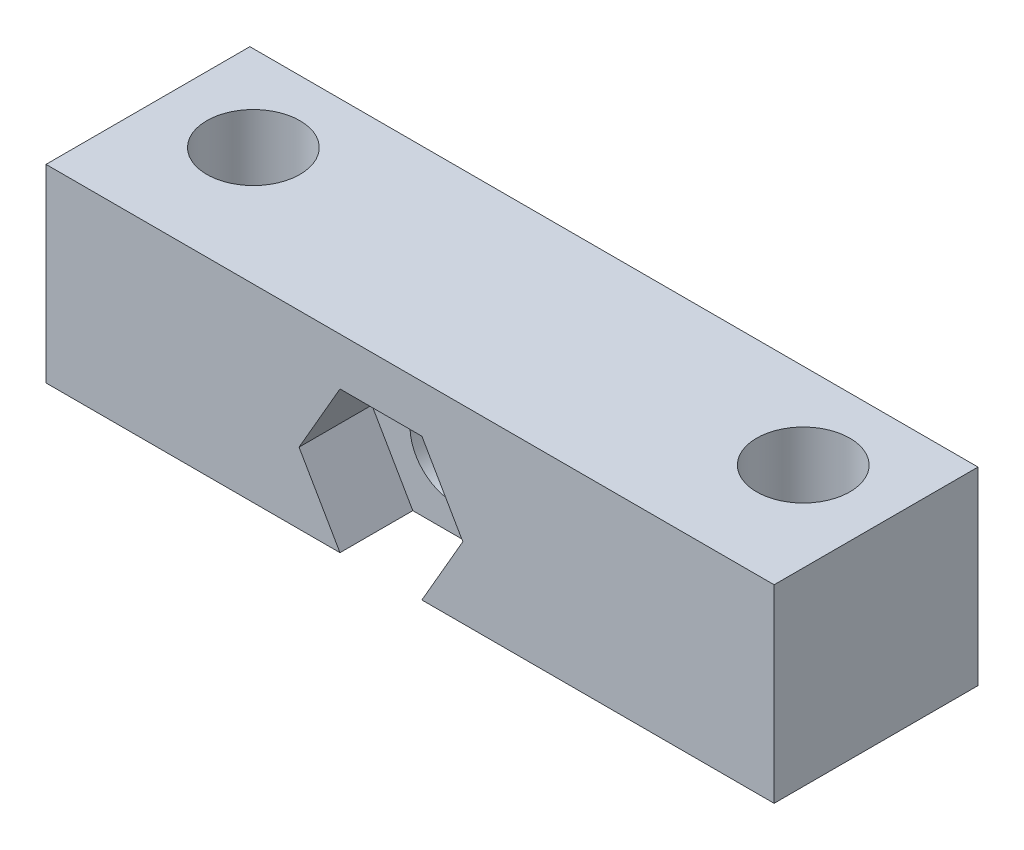
ISO-10303-21;
HEADER;
FILE_DESCRIPTION(('STEP AP214'),'2;1');
FILE_NAME('part.step','',(''),(''),'','','');
FILE_SCHEMA(('AUTOMOTIVE_DESIGN { 1 0 10303 214 1 1 1 1 }'));
ENDSEC;
DATA;
#1=APPLICATION_CONTEXT('core data for automotive mechanical design processes');
#2=APPLICATION_PROTOCOL_DEFINITION('international standard','automotive_design',2000,#1);
#3=PRODUCT_CONTEXT('',#1,'mechanical');
#4=PRODUCT('Part','Part','',(#3));
#5=PRODUCT_RELATED_PRODUCT_CATEGORY('part','',(#4));
#6=PRODUCT_DEFINITION_FORMATION('','',#4);
#7=PRODUCT_DEFINITION_CONTEXT('part definition',#1,'design');
#8=PRODUCT_DEFINITION('design','',#6,#7);
#9=PRODUCT_DEFINITION_SHAPE('','',#8);
#10=(LENGTH_UNIT() NAMED_UNIT(*) SI_UNIT(.MILLI.,.METRE.));
#11=(NAMED_UNIT(*) PLANE_ANGLE_UNIT() SI_UNIT($,.RADIAN.));
#12=(NAMED_UNIT(*) SI_UNIT($,.STERADIAN.) SOLID_ANGLE_UNIT());
#13=UNCERTAINTY_MEASURE_WITH_UNIT(LENGTH_MEASURE(1.E-05),#10,'distance_accuracy_value','');
#14=(GEOMETRIC_REPRESENTATION_CONTEXT(3) GLOBAL_UNCERTAINTY_ASSIGNED_CONTEXT((#13)) GLOBAL_UNIT_ASSIGNED_CONTEXT((#10,
#11,#12)) REPRESENTATION_CONTEXT('',''));
#15=CARTESIAN_POINT('',(0.,0.,0.));
#16=DIRECTION('',(0.,0.,1.));
#17=DIRECTION('',(1.,0.,0.));
#18=AXIS2_PLACEMENT_3D('',#15,#16,#17);
#19=CARTESIAN_POINT('',(0.,0.,0.));
#20=DIRECTION('',(0.,1.,0.));
#21=DIRECTION('',(0.,0.,1.));
#22=AXIS2_PLACEMENT_3D('',#19,#20,#21);
#23=PLANE('',#22);
#24=CARTESIAN_POINT('',(-8.44,0.,-0.560000000000005));
#25=DIRECTION('',(0.,1.,0.));
#26=DIRECTION('',(0.,0.,1.));
#27=AXIS2_PLACEMENT_3D('',#24,#25,#26);
#28=CIRCLE('',#27,1.6);
#29=CARTESIAN_POINT('',(-8.44,0.,-2.16));
#30=VERTEX_POINT('',#29);
#31=EDGE_CURVE('E285',#30,#30,#28,.T.);
#32=ORIENTED_EDGE('',*,*,#31,.T.);
#33=EDGE_LOOP('',(#32));
#34=FACE_BOUND('',#33,.T.);
#35=CARTESIAN_POINT('',(10.44,0.,-0.560000000000005));
#36=DIRECTION('',(0.,1.,0.));
#37=DIRECTION('',(0.,0.,1.));
#38=AXIS2_PLACEMENT_3D('',#35,#36,#37);
#39=CIRCLE('',#38,1.6);
#40=CARTESIAN_POINT('',(10.44,0.,-2.16));
#41=VERTEX_POINT('',#40);
#42=EDGE_CURVE('E301',#41,#41,#39,.T.);
#43=ORIENTED_EDGE('',*,*,#42,.T.);
#44=EDGE_LOOP('',(#43));
#45=FACE_BOUND('',#44,.T.);
#46=DIRECTION('',(0.,0.,-1.));
#47=VECTOR('',#46,1.);
#48=CARTESIAN_POINT('',(1.40584790547674,0.,3.5));
#49=LINE('',#48,#47);
#50=CARTESIAN_POINT('',(1.40584790547674,0.,3.5));
#51=VERTEX_POINT('',#50);
#52=CARTESIAN_POINT('',(1.40584790547674,0.,1.));
#53=VERTEX_POINT('',#52);
#54=EDGE_CURVE('E153',#51,#53,#49,.T.);
#55=ORIENTED_EDGE('',*,*,#54,.T.);
#56=DIRECTION('',(1.,0.,0.));
#57=VECTOR('',#56,1.);
#58=CARTESIAN_POINT('',(-1.40584790547674,0.,1.));
#59=LINE('',#58,#57);
#60=CARTESIAN_POINT('',(-1.40584790547674,0.,1.));
#61=VERTEX_POINT('',#60);
#62=EDGE_CURVE('E519',#61,#53,#59,.T.);
#63=ORIENTED_EDGE('',*,*,#62,.F.);
#64=DIRECTION('',(0.,0.,-1.));
#65=VECTOR('',#64,1.);
#66=CARTESIAN_POINT('',(-1.40584790547674,0.,3.5));
#67=LINE('',#66,#65);
#68=CARTESIAN_POINT('',(-1.40584790547674,0.,3.5));
#69=VERTEX_POINT('',#68);
#70=EDGE_CURVE('E217',#69,#61,#67,.T.);
#71=ORIENTED_EDGE('',*,*,#70,.F.);
#72=DIRECTION('',(1.,0.,0.));
#73=VECTOR('',#72,1.);
#74=CARTESIAN_POINT('',(-11.5,0.,3.5));
#75=LINE('',#74,#73);
#76=CARTESIAN_POINT('',(-11.5,0.,3.5));
#77=VERTEX_POINT('',#76);
#78=EDGE_CURVE('E183',#77,#69,#75,.T.);
#79=ORIENTED_EDGE('',*,*,#78,.F.);
#80=DIRECTION('',(0.,0.,1.));
#81=VECTOR('',#80,1.);
#82=CARTESIAN_POINT('',(-11.5,0.,-3.5));
#83=LINE('',#82,#81);
#84=CARTESIAN_POINT('',(-11.5,0.,-3.5));
#85=VERTEX_POINT('',#84);
#86=EDGE_CURVE('E184',#85,#77,#83,.T.);
#87=ORIENTED_EDGE('',*,*,#86,.F.);
#88=DIRECTION('',(-1.,0.,0.));
#89=VECTOR('',#88,1.);
#90=CARTESIAN_POINT('',(-11.5,0.,-3.5));
#91=LINE('',#90,#89);
#92=CARTESIAN_POINT('',(-1.40584790547674,0.,-3.5));
#93=VERTEX_POINT('',#92);
#94=EDGE_CURVE('E214',#93,#85,#91,.T.);
#95=ORIENTED_EDGE('',*,*,#94,.F.);
#96=DIRECTION('',(0.,0.,1.));
#97=VECTOR('',#96,1.);
#98=CARTESIAN_POINT('',(-1.40584790547674,0.,-3.5));
#99=LINE('',#98,#97);
#100=CARTESIAN_POINT('',(-1.40584790547674,0.,-1.));
#101=VERTEX_POINT('',#100);
#102=EDGE_CURVE('E282',#93,#101,#99,.T.);
#103=ORIENTED_EDGE('',*,*,#102,.T.);
#104=DIRECTION('',(1.,0.,0.));
#105=VECTOR('',#104,1.);
#106=CARTESIAN_POINT('',(-1.40584790547674,0.,-1.));
#107=LINE('',#106,#105);
#108=CARTESIAN_POINT('',(1.40584790547674,0.,-1.));
#109=VERTEX_POINT('',#108);
#110=EDGE_CURVE('E165',#101,#109,#107,.T.);
#111=ORIENTED_EDGE('',*,*,#110,.T.);
#112=DIRECTION('',(0.,0.,1.));
#113=VECTOR('',#112,1.);
#114=CARTESIAN_POINT('',(1.40584790547674,0.,-3.5));
#115=LINE('',#114,#113);
#116=CARTESIAN_POINT('',(1.40584790547674,0.,-3.5));
#117=VERTEX_POINT('',#116);
#118=EDGE_CURVE('E248',#117,#109,#115,.T.);
#119=ORIENTED_EDGE('',*,*,#118,.F.);
#120=CARTESIAN_POINT('',(13.5,0.,-3.5));
#121=VERTEX_POINT('',#120);
#122=EDGE_CURVE('E190',#121,#117,#91,.T.);
#123=ORIENTED_EDGE('',*,*,#122,.F.);
#124=DIRECTION('',(0.,0.,-1.));
#125=VECTOR('',#124,1.);
#126=CARTESIAN_POINT('',(13.5,0.,-3.5));
#127=LINE('',#126,#125);
#128=CARTESIAN_POINT('',(13.5,0.,3.5));
#129=VERTEX_POINT('',#128);
#130=EDGE_CURVE('E181',#129,#121,#127,.T.);
#131=ORIENTED_EDGE('',*,*,#130,.F.);
#132=EDGE_CURVE('E172',#51,#129,#75,.T.);
#133=ORIENTED_EDGE('',*,*,#132,.F.);
#134=EDGE_LOOP('',(#55,#63,#71,#79,#87,#95,#103,#111,#119,#123,#131,#133));
#135=FACE_BOUND('',#134,.T.);
#136=ADVANCED_FACE('F39',(#34,#45,#135),#23,.F.);
#137=CARTESIAN_POINT('',(0.,6.5,0.));
#138=DIRECTION('',(0.,1.,0.));
#139=DIRECTION('',(0.,0.,1.));
#140=AXIS2_PLACEMENT_3D('',#137,#138,#139);
#141=PLANE('',#140);
#142=CARTESIAN_POINT('',(10.44,6.5,-0.560000000000005));
#143=DIRECTION('',(0.,1.,0.));
#144=DIRECTION('',(0.,0.,1.));
#145=AXIS2_PLACEMENT_3D('',#142,#143,#144);
#146=CIRCLE('',#145,1.6);
#147=CARTESIAN_POINT('',(10.44,6.5,-2.16));
#148=VERTEX_POINT('',#147);
#149=EDGE_CURVE('E233',#148,#148,#146,.T.);
#150=ORIENTED_EDGE('',*,*,#149,.F.);
#151=EDGE_LOOP('',(#150));
#152=FACE_BOUND('',#151,.T.);
#153=DIRECTION('',(0.,0.,-1.));
#154=VECTOR('',#153,1.);
#155=CARTESIAN_POINT('',(13.5,6.5,-3.5));
#156=LINE('',#155,#154);
#157=CARTESIAN_POINT('',(13.5,6.5,3.5));
#158=VERTEX_POINT('',#157);
#159=CARTESIAN_POINT('',(13.5,6.5,-3.5));
#160=VERTEX_POINT('',#159);
#161=EDGE_CURVE('E189',#158,#160,#156,.T.);
#162=ORIENTED_EDGE('',*,*,#161,.T.);
#163=DIRECTION('',(-1.,0.,0.));
#164=VECTOR('',#163,1.);
#165=CARTESIAN_POINT('',(-11.5,6.5,-3.5));
#166=LINE('',#165,#164);
#167=CARTESIAN_POINT('',(-11.5,6.5,-3.5));
#168=VERTEX_POINT('',#167);
#169=EDGE_CURVE('E228',#160,#168,#166,.T.);
#170=ORIENTED_EDGE('',*,*,#169,.T.);
#171=DIRECTION('',(0.,0.,1.));
#172=VECTOR('',#171,1.);
#173=CARTESIAN_POINT('',(-11.5,6.5,-3.5));
#174=LINE('',#173,#172);
#175=CARTESIAN_POINT('',(-11.5,6.5,3.5));
#176=VERTEX_POINT('',#175);
#177=EDGE_CURVE('E209',#168,#176,#174,.T.);
#178=ORIENTED_EDGE('',*,*,#177,.T.);
#179=DIRECTION('',(1.,0.,0.));
#180=VECTOR('',#179,1.);
#181=CARTESIAN_POINT('',(-11.5,6.5,3.5));
#182=LINE('',#181,#180);
#183=EDGE_CURVE('E198',#176,#158,#182,.T.);
#184=ORIENTED_EDGE('',*,*,#183,.T.);
#185=EDGE_LOOP('',(#162,#170,#178,#184));
#186=FACE_BOUND('',#185,.T.);
#187=CARTESIAN_POINT('',(-8.44,6.5,-0.560000000000005));
#188=DIRECTION('',(0.,1.,0.));
#189=DIRECTION('',(0.,0.,1.));
#190=AXIS2_PLACEMENT_3D('',#187,#188,#189);
#191=CIRCLE('',#190,1.6);
#192=CARTESIAN_POINT('',(-8.44,6.5,-2.16));
#193=VERTEX_POINT('',#192);
#194=EDGE_CURVE('E297',#193,#193,#191,.T.);
#195=ORIENTED_EDGE('',*,*,#194,.F.);
#196=EDGE_LOOP('',(#195));
#197=FACE_BOUND('',#196,.T.);
#198=ADVANCED_FACE('F313',(#152,#186,#197),#141,.T.);
#199=CARTESIAN_POINT('',(13.5,6.5,-3.5));
#200=DIRECTION('',(-1.,0.,0.));
#201=DIRECTION('',(0.,0.,1.));
#202=AXIS2_PLACEMENT_3D('',#199,#200,#201);
#203=PLANE('',#202);
#204=ORIENTED_EDGE('',*,*,#130,.T.);
#205=DIRECTION('',(0.,-1.,0.));
#206=VECTOR('',#205,1.);
#207=CARTESIAN_POINT('',(13.5,6.5,-3.5));
#208=LINE('',#207,#206);
#209=EDGE_CURVE('E11',#160,#121,#208,.T.);
#210=ORIENTED_EDGE('',*,*,#209,.F.);
#211=ORIENTED_EDGE('',*,*,#161,.F.);
#212=DIRECTION('',(0.,-1.,0.));
#213=VECTOR('',#212,1.);
#214=CARTESIAN_POINT('',(13.5,6.5,3.5));
#215=LINE('',#214,#213);
#216=EDGE_CURVE('E194',#158,#129,#215,.T.);
#217=ORIENTED_EDGE('',*,*,#216,.T.);
#218=EDGE_LOOP('',(#204,#210,#211,#217));
#219=FACE_BOUND('',#218,.T.);
#220=ADVANCED_FACE('F41',(#219),#203,.F.);
#221=CARTESIAN_POINT('',(-11.5,6.5,-3.5));
#222=DIRECTION('',(0.,0.,1.));
#223=DIRECTION('',(1.,0.,0.));
#224=AXIS2_PLACEMENT_3D('',#221,#222,#223);
#225=PLANE('',#224);
#226=DIRECTION('',(-0.5,-0.866025403784438,0.));
#227=VECTOR('',#226,1.);
#228=CARTESIAN_POINT('',(-1.40584790547674,4.87000000000001,-3.5));
#229=LINE('',#228,#227);
#230=CARTESIAN_POINT('',(-1.40584790547674,4.87000000000001,-3.5));
#231=VERTEX_POINT('',#230);
#232=CARTESIAN_POINT('',(-2.81169581095348,2.435,-3.5));
#233=VERTEX_POINT('',#232);
#234=EDGE_CURVE('E245',#231,#233,#229,.T.);
#235=ORIENTED_EDGE('',*,*,#234,.T.);
#236=DIRECTION('',(0.5,-0.866025403784439,0.));
#237=VECTOR('',#236,1.);
#238=CARTESIAN_POINT('',(-2.81169581095348,2.435,-3.5));
#239=LINE('',#238,#237);
#240=EDGE_CURVE('E242',#233,#93,#239,.T.);
#241=ORIENTED_EDGE('',*,*,#240,.T.);
#242=ORIENTED_EDGE('',*,*,#94,.T.);
#243=DIRECTION('',(0.,-1.,0.));
#244=VECTOR('',#243,1.);
#245=CARTESIAN_POINT('',(-11.5,6.5,-3.5));
#246=LINE('',#245,#244);
#247=EDGE_CURVE('E48',#168,#85,#246,.T.);
#248=ORIENTED_EDGE('',*,*,#247,.F.);
#249=ORIENTED_EDGE('',*,*,#169,.F.);
#250=ORIENTED_EDGE('',*,*,#209,.T.);
#251=ORIENTED_EDGE('',*,*,#122,.T.);
#252=DIRECTION('',(0.5,0.866025403784438,0.));
#253=VECTOR('',#252,1.);
#254=CARTESIAN_POINT('',(1.40584790547674,0.,-3.5));
#255=LINE('',#254,#253);
#256=CARTESIAN_POINT('',(2.81169581095348,2.435,-3.5));
#257=VERTEX_POINT('',#256);
#258=EDGE_CURVE('E281',#117,#257,#255,.T.);
#259=ORIENTED_EDGE('',*,*,#258,.T.);
#260=DIRECTION('',(-0.5,0.866025403784439,0.));
#261=VECTOR('',#260,1.);
#262=CARTESIAN_POINT('',(2.81169581095348,2.435,-3.5));
#263=LINE('',#262,#261);
#264=CARTESIAN_POINT('',(1.40584790547674,4.87000000000001,-3.5));
#265=VERTEX_POINT('',#264);
#266=EDGE_CURVE('E63',#257,#265,#263,.T.);
#267=ORIENTED_EDGE('',*,*,#266,.T.);
#268=DIRECTION('',(-1.,0.,0.));
#269=VECTOR('',#268,1.);
#270=CARTESIAN_POINT('',(1.40584790547674,4.87000000000001,-3.5));
#271=LINE('',#270,#269);
#272=EDGE_CURVE('E254',#265,#231,#271,.T.);
#273=ORIENTED_EDGE('',*,*,#272,.T.);
#274=EDGE_LOOP('',(#235,#241,#242,#248,#249,#250,#251,#259,#267,#273));
#275=FACE_BOUND('',#274,.T.);
#276=ADVANCED_FACE('F240',(#275),#225,.F.);
#277=CARTESIAN_POINT('',(-11.5,6.5,-3.5));
#278=DIRECTION('',(1.,0.,0.));
#279=DIRECTION('',(0.,0.,-1.));
#280=AXIS2_PLACEMENT_3D('',#277,#278,#279);
#281=PLANE('',#280);
#282=ORIENTED_EDGE('',*,*,#86,.T.);
#283=DIRECTION('',(0.,-1.,0.));
#284=VECTOR('',#283,1.);
#285=CARTESIAN_POINT('',(-11.5,6.5,3.5));
#286=LINE('',#285,#284);
#287=EDGE_CURVE('E197',#176,#77,#286,.T.);
#288=ORIENTED_EDGE('',*,*,#287,.F.);
#289=ORIENTED_EDGE('',*,*,#177,.F.);
#290=ORIENTED_EDGE('',*,*,#247,.T.);
#291=EDGE_LOOP('',(#282,#288,#289,#290));
#292=FACE_BOUND('',#291,.T.);
#293=ADVANCED_FACE('F207',(#292),#281,.F.);
#294=CARTESIAN_POINT('',(-11.5,6.5,3.5));
#295=DIRECTION('',(0.,0.,-1.));
#296=DIRECTION('',(-1.,0.,0.));
#297=AXIS2_PLACEMENT_3D('',#294,#295,#296);
#298=PLANE('',#297);
#299=DIRECTION('',(0.5,0.866025403784438,0.));
#300=VECTOR('',#299,1.);
#301=CARTESIAN_POINT('',(1.40584790547674,0.,3.5));
#302=LINE('',#301,#300);
#303=CARTESIAN_POINT('',(2.81169581095348,2.435,3.5));
#304=VERTEX_POINT('',#303);
#305=EDGE_CURVE('E157',#51,#304,#302,.T.);
#306=ORIENTED_EDGE('',*,*,#305,.F.);
#307=ORIENTED_EDGE('',*,*,#132,.T.);
#308=ORIENTED_EDGE('',*,*,#216,.F.);
#309=ORIENTED_EDGE('',*,*,#183,.F.);
#310=ORIENTED_EDGE('',*,*,#287,.T.);
#311=ORIENTED_EDGE('',*,*,#78,.T.);
#312=DIRECTION('',(0.5,-0.866025403784439,0.));
#313=VECTOR('',#312,1.);
#314=CARTESIAN_POINT('',(-2.81169581095348,2.435,3.5));
#315=LINE('',#314,#313);
#316=CARTESIAN_POINT('',(-2.81169581095348,2.435,3.5));
#317=VERTEX_POINT('',#316);
#318=EDGE_CURVE('E220',#317,#69,#315,.T.);
#319=ORIENTED_EDGE('',*,*,#318,.F.);
#320=DIRECTION('',(-0.5,-0.866025403784438,0.));
#321=VECTOR('',#320,1.);
#322=CARTESIAN_POINT('',(-1.40584790547674,4.87000000000001,3.5));
#323=LINE('',#322,#321);
#324=CARTESIAN_POINT('',(-1.40584790547674,4.87000000000001,3.5));
#325=VERTEX_POINT('',#324);
#326=EDGE_CURVE('E531',#325,#317,#323,.T.);
#327=ORIENTED_EDGE('',*,*,#326,.F.);
#328=DIRECTION('',(-1.,0.,0.));
#329=VECTOR('',#328,1.);
#330=CARTESIAN_POINT('',(1.40584790547674,4.87000000000001,3.5));
#331=LINE('',#330,#329);
#332=CARTESIAN_POINT('',(1.40584790547674,4.87000000000001,3.5));
#333=VERTEX_POINT('',#332);
#334=EDGE_CURVE('E528',#333,#325,#331,.T.);
#335=ORIENTED_EDGE('',*,*,#334,.F.);
#336=DIRECTION('',(-0.5,0.866025403784439,0.));
#337=VECTOR('',#336,1.);
#338=CARTESIAN_POINT('',(2.81169581095348,2.435,3.5));
#339=LINE('',#338,#337);
#340=EDGE_CURVE('E175',#304,#333,#339,.T.);
#341=ORIENTED_EDGE('',*,*,#340,.F.);
#342=EDGE_LOOP('',(#306,#307,#308,#309,#310,#311,#319,#327,#335,#341));
#343=FACE_BOUND('',#342,.T.);
#344=ADVANCED_FACE('F170',(#343),#298,.F.);
#345=CARTESIAN_POINT('',(10.44,6.5,-0.560000000000005));
#346=DIRECTION('',(0.,-1.,0.));
#347=DIRECTION('',(0.,0.,-1.));
#348=AXIS2_PLACEMENT_3D('',#345,#346,#347);
#349=CYLINDRICAL_SURFACE('',#348,1.6);
#350=CARTESIAN_POINT('',(10.44,6.5,-2.16));
#351=CARTESIAN_POINT('',(10.44,6.43229166666667,-2.16));
#352=CARTESIAN_POINT('',(10.44,6.36458333333333,-2.16));
#353=CARTESIAN_POINT('',(10.44,6.22916666666667,-2.16));
#354=CARTESIAN_POINT('',(10.44,6.16145833333333,-2.16));
#355=CARTESIAN_POINT('',(10.44,6.02604166666667,-2.16));
#356=CARTESIAN_POINT('',(10.44,5.95833333333333,-2.16));
#357=CARTESIAN_POINT('',(10.44,5.82291666666667,-2.16));
#358=CARTESIAN_POINT('',(10.44,5.75520833333333,-2.16));
#359=CARTESIAN_POINT('',(10.44,5.61979166666667,-2.16));
#360=CARTESIAN_POINT('',(10.44,5.55208333333333,-2.16));
#361=CARTESIAN_POINT('',(10.44,5.41666666666667,-2.16));
#362=CARTESIAN_POINT('',(10.44,5.34895833333333,-2.16));
#363=CARTESIAN_POINT('',(10.44,5.21354166666667,-2.16));
#364=CARTESIAN_POINT('',(10.44,5.14583333333333,-2.16));
#365=CARTESIAN_POINT('',(10.44,5.01041666666667,-2.16));
#366=CARTESIAN_POINT('',(10.44,4.94270833333333,-2.16));
#367=CARTESIAN_POINT('',(10.44,4.80729166666667,-2.16));
#368=CARTESIAN_POINT('',(10.44,4.73958333333333,-2.16));
#369=CARTESIAN_POINT('',(10.44,4.60416666666667,-2.16));
#370=CARTESIAN_POINT('',(10.44,4.53645833333333,-2.16));
#371=CARTESIAN_POINT('',(10.44,4.40104166666667,-2.16));
#372=CARTESIAN_POINT('',(10.44,4.33333333333333,-2.16));
#373=CARTESIAN_POINT('',(10.44,4.19791666666667,-2.16));
#374=CARTESIAN_POINT('',(10.44,4.13020833333333,-2.16));
#375=CARTESIAN_POINT('',(10.44,3.99479166666667,-2.16));
#376=CARTESIAN_POINT('',(10.44,3.92708333333333,-2.16));
#377=CARTESIAN_POINT('',(10.44,3.79166666666667,-2.16));
#378=CARTESIAN_POINT('',(10.44,3.72395833333333,-2.16));
#379=CARTESIAN_POINT('',(10.44,3.58854166666667,-2.16));
#380=CARTESIAN_POINT('',(10.44,3.52083333333333,-2.16));
#381=CARTESIAN_POINT('',(10.44,3.38541666666667,-2.16));
#382=CARTESIAN_POINT('',(10.44,3.31770833333333,-2.16));
#383=CARTESIAN_POINT('',(10.44,3.18229166666667,-2.16));
#384=CARTESIAN_POINT('',(10.44,3.11458333333333,-2.16));
#385=CARTESIAN_POINT('',(10.44,2.97916666666667,-2.16));
#386=CARTESIAN_POINT('',(10.44,2.91145833333333,-2.16));
#387=CARTESIAN_POINT('',(10.44,2.77604166666667,-2.16));
#388=CARTESIAN_POINT('',(10.44,2.70833333333333,-2.16));
#389=CARTESIAN_POINT('',(10.44,2.57291666666667,-2.16));
#390=CARTESIAN_POINT('',(10.44,2.50520833333333,-2.16));
#391=CARTESIAN_POINT('',(10.44,2.36979166666667,-2.16));
#392=CARTESIAN_POINT('',(10.44,2.30208333333333,-2.16));
#393=CARTESIAN_POINT('',(10.44,2.16666666666667,-2.16));
#394=CARTESIAN_POINT('',(10.44,2.09895833333333,-2.16));
#395=CARTESIAN_POINT('',(10.44,1.96354166666667,-2.16));
#396=CARTESIAN_POINT('',(10.44,1.89583333333333,-2.16));
#397=CARTESIAN_POINT('',(10.44,1.76041666666667,-2.16));
#398=CARTESIAN_POINT('',(10.44,1.69270833333333,-2.16));
#399=CARTESIAN_POINT('',(10.44,1.55729166666667,-2.16));
#400=CARTESIAN_POINT('',(10.44,1.48958333333333,-2.16));
#401=CARTESIAN_POINT('',(10.44,1.35416666666667,-2.16));
#402=CARTESIAN_POINT('',(10.44,1.28645833333333,-2.16));
#403=CARTESIAN_POINT('',(10.44,1.15104166666667,-2.16));
#404=CARTESIAN_POINT('',(10.44,1.08333333333333,-2.16));
#405=CARTESIAN_POINT('',(10.44,0.947916666666667,-2.16));
#406=CARTESIAN_POINT('',(10.44,0.880208333333333,-2.16));
#407=CARTESIAN_POINT('',(10.44,0.744791666666667,-2.16));
#408=CARTESIAN_POINT('',(10.44,0.677083333333333,-2.16));
#409=CARTESIAN_POINT('',(10.44,0.541666666666667,-2.16));
#410=CARTESIAN_POINT('',(10.44,0.473958333333333,-2.16));
#411=CARTESIAN_POINT('',(10.44,0.338541666666667,-2.16));
#412=CARTESIAN_POINT('',(10.44,0.270833333333334,-2.16));
#413=CARTESIAN_POINT('',(10.44,0.135416666666667,-2.16));
#414=CARTESIAN_POINT('',(10.44,0.0677083333333334,-2.16));
#415=CARTESIAN_POINT('',(10.44,0.,-2.16));
#416=B_SPLINE_CURVE_WITH_KNOTS('',3,(#350,#351,#352,#353,#354,#355,#356,#357,#358,#359,#360,
#361,#362,#363,#364,#365,#366,#367,#368,#369,#370,#371,#372,#373,#374,#375,#376,#377,#378,#379,
#380,#381,#382,#383,#384,#385,#386,#387,#388,#389,#390,#391,#392,#393,#394,#395,#396,#397,#398,
#399,#400,#401,#402,#403,#404,#405,#406,#407,#408,#409,#410,#411,#412,#413,#414,#415),
.UNSPECIFIED.,.F.,.F.,(4,2,2,2,2,2,2,2,2,2,2,2,2,2,2,2,2,2,2,2,2,2,2,2,2,2,2,2,2,2,2,2,4),(0.,
0.203125,0.40625,0.609375000000001,0.812500000000001,1.015625,1.21875,1.421875,1.625,1.828125,
2.03125,2.234375,2.4375,2.640625,2.84375,3.046875,3.25,3.453125,3.65625,3.859375,4.0625,
4.265625,4.46875,4.671875,4.875,5.078125,5.28125,5.484375,5.6875,5.890625,6.09375,6.296875,6.5),.UNSPECIFIED.);
#417=EDGE_CURVE('BSEAM334',#148,#41,#416,.T.);
#418=ORIENTED_EDGE('',*,*,#149,.T.);
#419=ORIENTED_EDGE('',*,*,#42,.F.);
#420=ORIENTED_EDGE('',*,*,#417,.T.);
#421=ORIENTED_EDGE('',*,*,#417,.F.);
#422=EDGE_LOOP('',(#418,#420,#419,#421));
#423=FACE_BOUND('',#422,.T.);
#424=ADVANCED_FACE('F334',(#423),#349,.F.);
#425=CARTESIAN_POINT('',(-8.44,6.5,-0.560000000000005));
#426=DIRECTION('',(0.,-1.,0.));
#427=DIRECTION('',(0.,0.,-1.));
#428=AXIS2_PLACEMENT_3D('',#425,#426,#427);
#429=CYLINDRICAL_SURFACE('',#428,1.6);
#430=CARTESIAN_POINT('',(-8.44,6.5,-2.16));
#431=CARTESIAN_POINT('',(-8.44,6.43229166666667,-2.16));
#432=CARTESIAN_POINT('',(-8.44,6.36458333333333,-2.16));
#433=CARTESIAN_POINT('',(-8.44,6.22916666666667,-2.16));
#434=CARTESIAN_POINT('',(-8.44,6.16145833333333,-2.16));
#435=CARTESIAN_POINT('',(-8.44,6.02604166666667,-2.16));
#436=CARTESIAN_POINT('',(-8.44,5.95833333333333,-2.16));
#437=CARTESIAN_POINT('',(-8.44,5.82291666666667,-2.16));
#438=CARTESIAN_POINT('',(-8.44,5.75520833333333,-2.16));
#439=CARTESIAN_POINT('',(-8.44,5.61979166666667,-2.16));
#440=CARTESIAN_POINT('',(-8.44,5.55208333333333,-2.16));
#441=CARTESIAN_POINT('',(-8.44,5.41666666666667,-2.16));
#442=CARTESIAN_POINT('',(-8.44,5.34895833333333,-2.16));
#443=CARTESIAN_POINT('',(-8.44,5.21354166666667,-2.16));
#444=CARTESIAN_POINT('',(-8.44,5.14583333333333,-2.16));
#445=CARTESIAN_POINT('',(-8.44,5.01041666666667,-2.16));
#446=CARTESIAN_POINT('',(-8.44,4.94270833333333,-2.16));
#447=CARTESIAN_POINT('',(-8.44,4.80729166666667,-2.16));
#448=CARTESIAN_POINT('',(-8.44,4.73958333333333,-2.16));
#449=CARTESIAN_POINT('',(-8.44,4.60416666666667,-2.16));
#450=CARTESIAN_POINT('',(-8.44,4.53645833333333,-2.16));
#451=CARTESIAN_POINT('',(-8.44,4.40104166666667,-2.16));
#452=CARTESIAN_POINT('',(-8.44,4.33333333333333,-2.16));
#453=CARTESIAN_POINT('',(-8.44,4.19791666666667,-2.16));
#454=CARTESIAN_POINT('',(-8.44,4.13020833333333,-2.16));
#455=CARTESIAN_POINT('',(-8.44,3.99479166666667,-2.16));
#456=CARTESIAN_POINT('',(-8.44,3.92708333333333,-2.16));
#457=CARTESIAN_POINT('',(-8.44,3.79166666666667,-2.16));
#458=CARTESIAN_POINT('',(-8.44,3.72395833333333,-2.16));
#459=CARTESIAN_POINT('',(-8.44,3.58854166666667,-2.16));
#460=CARTESIAN_POINT('',(-8.44,3.52083333333333,-2.16));
#461=CARTESIAN_POINT('',(-8.44,3.38541666666667,-2.16));
#462=CARTESIAN_POINT('',(-8.44,3.31770833333333,-2.16));
#463=CARTESIAN_POINT('',(-8.44,3.18229166666667,-2.16));
#464=CARTESIAN_POINT('',(-8.44,3.11458333333333,-2.16));
#465=CARTESIAN_POINT('',(-8.44,2.97916666666667,-2.16));
#466=CARTESIAN_POINT('',(-8.44,2.91145833333333,-2.16));
#467=CARTESIAN_POINT('',(-8.44,2.77604166666667,-2.16));
#468=CARTESIAN_POINT('',(-8.44,2.70833333333333,-2.16));
#469=CARTESIAN_POINT('',(-8.44,2.57291666666667,-2.16));
#470=CARTESIAN_POINT('',(-8.44,2.50520833333333,-2.16));
#471=CARTESIAN_POINT('',(-8.44,2.36979166666667,-2.16));
#472=CARTESIAN_POINT('',(-8.44,2.30208333333333,-2.16));
#473=CARTESIAN_POINT('',(-8.44,2.16666666666667,-2.16));
#474=CARTESIAN_POINT('',(-8.44,2.09895833333333,-2.16));
#475=CARTESIAN_POINT('',(-8.44,1.96354166666667,-2.16));
#476=CARTESIAN_POINT('',(-8.44,1.89583333333333,-2.16));
#477=CARTESIAN_POINT('',(-8.44,1.76041666666667,-2.16));
#478=CARTESIAN_POINT('',(-8.44,1.69270833333333,-2.16));
#479=CARTESIAN_POINT('',(-8.44,1.55729166666667,-2.16));
#480=CARTESIAN_POINT('',(-8.44,1.48958333333333,-2.16));
#481=CARTESIAN_POINT('',(-8.44,1.35416666666667,-2.16));
#482=CARTESIAN_POINT('',(-8.44,1.28645833333333,-2.16));
#483=CARTESIAN_POINT('',(-8.44,1.15104166666667,-2.16));
#484=CARTESIAN_POINT('',(-8.44,1.08333333333333,-2.16));
#485=CARTESIAN_POINT('',(-8.44,0.947916666666667,-2.16));
#486=CARTESIAN_POINT('',(-8.44,0.880208333333333,-2.16));
#487=CARTESIAN_POINT('',(-8.44,0.744791666666667,-2.16));
#488=CARTESIAN_POINT('',(-8.44,0.677083333333333,-2.16));
#489=CARTESIAN_POINT('',(-8.44,0.541666666666667,-2.16));
#490=CARTESIAN_POINT('',(-8.44,0.473958333333333,-2.16));
#491=CARTESIAN_POINT('',(-8.44,0.338541666666667,-2.16));
#492=CARTESIAN_POINT('',(-8.44,0.270833333333334,-2.16));
#493=CARTESIAN_POINT('',(-8.44,0.135416666666667,-2.16));
#494=CARTESIAN_POINT('',(-8.44,0.0677083333333334,-2.16));
#495=CARTESIAN_POINT('',(-8.44,0.,-2.16));
#496=B_SPLINE_CURVE_WITH_KNOTS('',3,(#430,#431,#432,#433,#434,#435,#436,#437,#438,#439,#440,
#441,#442,#443,#444,#445,#446,#447,#448,#449,#450,#451,#452,#453,#454,#455,#456,#457,#458,#459,
#460,#461,#462,#463,#464,#465,#466,#467,#468,#469,#470,#471,#472,#473,#474,#475,#476,#477,#478,
#479,#480,#481,#482,#483,#484,#485,#486,#487,#488,#489,#490,#491,#492,#493,#494,#495),
.UNSPECIFIED.,.F.,.F.,(4,2,2,2,2,2,2,2,2,2,2,2,2,2,2,2,2,2,2,2,2,2,2,2,2,2,2,2,2,2,2,2,4),(0.,
0.203125,0.40625,0.609375000000001,0.812500000000001,1.015625,1.21875,1.421875,1.625,1.828125,
2.03125,2.234375,2.4375,2.640625,2.84375,3.046875,3.25,3.453125,3.65625,3.859375,4.0625,
4.265625,4.46875,4.671875,4.875,5.078125,5.28125,5.484375,5.6875,5.890625,6.09375,6.296875,6.5),.UNSPECIFIED.);
#497=EDGE_CURVE('BSEAM351',#193,#30,#496,.T.);
#498=ORIENTED_EDGE('',*,*,#194,.T.);
#499=ORIENTED_EDGE('',*,*,#31,.F.);
#500=ORIENTED_EDGE('',*,*,#497,.T.);
#501=ORIENTED_EDGE('',*,*,#497,.F.);
#502=EDGE_LOOP('',(#498,#500,#499,#501));
#503=FACE_BOUND('',#502,.T.);
#504=ADVANCED_FACE('F351',(#503),#429,.F.);
#505=CARTESIAN_POINT('',(-2.81169581095348,2.435,-3.5));
#506=DIRECTION('',(-0.866025403784439,-0.499999999999999,0.));
#507=DIRECTION('',(0.5,-0.866025403784439,0.));
#508=AXIS2_PLACEMENT_3D('',#505,#506,#507);
#509=PLANE('',#508);
#510=DIRECTION('',(0.5,-0.866025403784439,0.));
#511=VECTOR('',#510,1.);
#512=CARTESIAN_POINT('',(-2.81169581095348,2.435,-1.));
#513=LINE('',#512,#511);
#514=CARTESIAN_POINT('',(-2.81169581095348,2.435,-1.));
#515=VERTEX_POINT('',#514);
#516=EDGE_CURVE('E277',#515,#101,#513,.T.);
#517=ORIENTED_EDGE('',*,*,#516,.T.);
#518=ORIENTED_EDGE('',*,*,#102,.F.);
#519=ORIENTED_EDGE('',*,*,#240,.F.);
#520=DIRECTION('',(0.,0.,1.));
#521=VECTOR('',#520,1.);
#522=CARTESIAN_POINT('',(-2.81169581095348,2.435,-3.5));
#523=LINE('',#522,#521);
#524=EDGE_CURVE('E286',#233,#515,#523,.T.);
#525=ORIENTED_EDGE('',*,*,#524,.T.);
#526=EDGE_LOOP('',(#517,#518,#519,#525));
#527=FACE_BOUND('',#526,.T.);
#528=ADVANCED_FACE('F358',(#527),#509,.F.);
#529=CARTESIAN_POINT('',(-1.40584790547674,4.87000000000001,-3.5));
#530=DIRECTION('',(-0.866025403784438,0.5,0.));
#531=DIRECTION('',(-0.5,-0.866025403784439,0.));
#532=AXIS2_PLACEMENT_3D('',#529,#530,#531);
#533=PLANE('',#532);
#534=DIRECTION('',(-0.5,-0.866025403784438,0.));
#535=VECTOR('',#534,1.);
#536=CARTESIAN_POINT('',(-1.40584790547674,4.87000000000001,-1.));
#537=LINE('',#536,#535);
#538=CARTESIAN_POINT('',(-1.40584790547674,4.87000000000001,-1.));
#539=VERTEX_POINT('',#538);
#540=EDGE_CURVE('E273',#539,#515,#537,.T.);
#541=ORIENTED_EDGE('',*,*,#540,.T.);
#542=ORIENTED_EDGE('',*,*,#524,.F.);
#543=ORIENTED_EDGE('',*,*,#234,.F.);
#544=DIRECTION('',(0.,0.,1.));
#545=VECTOR('',#544,1.);
#546=CARTESIAN_POINT('',(-1.40584790547674,4.87000000000001,-3.5));
#547=LINE('',#546,#545);
#548=EDGE_CURVE('E289',#231,#539,#547,.T.);
#549=ORIENTED_EDGE('',*,*,#548,.T.);
#550=EDGE_LOOP('',(#541,#542,#543,#549));
#551=FACE_BOUND('',#550,.T.);
#552=ADVANCED_FACE('F366',(#551),#533,.F.);
#553=CARTESIAN_POINT('',(1.40584790547674,4.87000000000001,-3.5));
#554=DIRECTION('',(0.,1.,0.));
#555=DIRECTION('',(0.,0.,1.));
#556=AXIS2_PLACEMENT_3D('',#553,#554,#555);
#557=PLANE('',#556);
#558=DIRECTION('',(-1.,0.,0.));
#559=VECTOR('',#558,1.);
#560=CARTESIAN_POINT('',(1.40584790547674,4.87000000000001,-1.));
#561=LINE('',#560,#559);
#562=CARTESIAN_POINT('',(1.40584790547674,4.87000000000001,-1.));
#563=VERTEX_POINT('',#562);
#564=EDGE_CURVE('E269',#563,#539,#561,.T.);
#565=ORIENTED_EDGE('',*,*,#564,.T.);
#566=ORIENTED_EDGE('',*,*,#548,.F.);
#567=ORIENTED_EDGE('',*,*,#272,.F.);
#568=DIRECTION('',(0.,0.,1.));
#569=VECTOR('',#568,1.);
#570=CARTESIAN_POINT('',(1.40584790547674,4.87000000000001,-3.5));
#571=LINE('',#570,#569);
#572=EDGE_CURVE('E292',#265,#563,#571,.T.);
#573=ORIENTED_EDGE('',*,*,#572,.T.);
#574=EDGE_LOOP('',(#565,#566,#567,#573));
#575=FACE_BOUND('',#574,.T.);
#576=ADVANCED_FACE('F373',(#575),#557,.F.);
#577=CARTESIAN_POINT('',(2.81169581095348,2.435,-3.5));
#578=DIRECTION('',(0.866025403784439,0.5,0.));
#579=DIRECTION('',(-0.5,0.866025403784439,0.));
#580=AXIS2_PLACEMENT_3D('',#577,#578,#579);
#581=PLANE('',#580);
#582=DIRECTION('',(-0.5,0.866025403784439,0.));
#583=VECTOR('',#582,1.);
#584=CARTESIAN_POINT('',(2.81169581095348,2.435,-1.));
#585=LINE('',#584,#583);
#586=CARTESIAN_POINT('',(2.81169581095348,2.435,-1.));
#587=VERTEX_POINT('',#586);
#588=EDGE_CURVE('E265',#587,#563,#585,.T.);
#589=ORIENTED_EDGE('',*,*,#588,.T.);
#590=ORIENTED_EDGE('',*,*,#572,.F.);
#591=ORIENTED_EDGE('',*,*,#266,.F.);
#592=DIRECTION('',(0.,0.,1.));
#593=VECTOR('',#592,1.);
#594=CARTESIAN_POINT('',(2.81169581095348,2.435,-3.5));
#595=LINE('',#594,#593);
#596=EDGE_CURVE('E252',#257,#587,#595,.T.);
#597=ORIENTED_EDGE('',*,*,#596,.T.);
#598=EDGE_LOOP('',(#589,#590,#591,#597));
#599=FACE_BOUND('',#598,.T.);
#600=ADVANCED_FACE('F381',(#599),#581,.F.);
#601=CARTESIAN_POINT('',(1.40584790547674,0.,-3.5));
#602=DIRECTION('',(0.866025403784438,-0.5,0.));
#603=DIRECTION('',(0.5,0.866025403784438,0.));
#604=AXIS2_PLACEMENT_3D('',#601,#602,#603);
#605=PLANE('',#604);
#606=DIRECTION('',(0.5,0.866025403784438,0.));
#607=VECTOR('',#606,1.);
#608=CARTESIAN_POINT('',(1.40584790547674,0.,-1.));
#609=LINE('',#608,#607);
#610=EDGE_CURVE('E261',#109,#587,#609,.T.);
#611=ORIENTED_EDGE('',*,*,#610,.T.);
#612=ORIENTED_EDGE('',*,*,#596,.F.);
#613=ORIENTED_EDGE('',*,*,#258,.F.);
#614=ORIENTED_EDGE('',*,*,#118,.T.);
#615=EDGE_LOOP('',(#611,#612,#613,#614));
#616=FACE_BOUND('',#615,.T.);
#617=ADVANCED_FACE('F389',(#616),#605,.F.);
#618=CARTESIAN_POINT('',(0.,0.,-1.));
#619=DIRECTION('',(0.,0.,1.));
#620=DIRECTION('',(1.,0.,0.));
#621=AXIS2_PLACEMENT_3D('',#618,#619,#620);
#622=PLANE('',#621);
#623=CARTESIAN_POINT('',(0.,2.435,-1.));
#624=DIRECTION('',(0.,0.,1.));
#625=DIRECTION('',(1.,0.,0.));
#626=AXIS2_PLACEMENT_3D('',#623,#624,#625);
#627=CIRCLE('',#626,1.5);
#628=CARTESIAN_POINT('',(1.5,2.435,-1.));
#629=VERTEX_POINT('',#628);
#630=EDGE_CURVE('E517',#629,#629,#627,.T.);
#631=ORIENTED_EDGE('',*,*,#630,.T.);
#632=EDGE_LOOP('',(#631));
#633=FACE_BOUND('',#632,.T.);
#634=ORIENTED_EDGE('',*,*,#110,.F.);
#635=ORIENTED_EDGE('',*,*,#516,.F.);
#636=ORIENTED_EDGE('',*,*,#540,.F.);
#637=ORIENTED_EDGE('',*,*,#564,.F.);
#638=ORIENTED_EDGE('',*,*,#588,.F.);
#639=ORIENTED_EDGE('',*,*,#610,.F.);
#640=EDGE_LOOP('',(#634,#635,#636,#637,#638,#639));
#641=FACE_BOUND('',#640,.T.);
#642=ADVANCED_FACE('F396',(#633,#641),#622,.F.);
#643=CARTESIAN_POINT('',(0.,0.,1.));
#644=DIRECTION('',(0.,0.,1.));
#645=DIRECTION('',(1.,0.,0.));
#646=AXIS2_PLACEMENT_3D('',#643,#644,#645);
#647=PLANE('',#646);
#648=ORIENTED_EDGE('',*,*,#62,.T.);
#649=DIRECTION('',(0.5,0.866025403784438,0.));
#650=VECTOR('',#649,1.);
#651=CARTESIAN_POINT('',(1.40584790547674,0.,1.));
#652=LINE('',#651,#650);
#653=CARTESIAN_POINT('',(2.81169581095348,2.435,1.));
#654=VERTEX_POINT('',#653);
#655=EDGE_CURVE('E159',#53,#654,#652,.T.);
#656=ORIENTED_EDGE('',*,*,#655,.T.);
#657=DIRECTION('',(-0.5,0.866025403784439,0.));
#658=VECTOR('',#657,1.);
#659=CARTESIAN_POINT('',(2.81169581095348,2.435,1.));
#660=LINE('',#659,#658);
#661=CARTESIAN_POINT('',(1.40584790547674,4.87000000000001,1.));
#662=VERTEX_POINT('',#661);
#663=EDGE_CURVE('E538',#654,#662,#660,.T.);
#664=ORIENTED_EDGE('',*,*,#663,.T.);
#665=DIRECTION('',(-1.,0.,0.));
#666=VECTOR('',#665,1.);
#667=CARTESIAN_POINT('',(1.40584790547674,4.87000000000001,1.));
#668=LINE('',#667,#666);
#669=CARTESIAN_POINT('',(-1.40584790547674,4.87000000000001,1.));
#670=VERTEX_POINT('',#669);
#671=EDGE_CURVE('E541',#662,#670,#668,.T.);
#672=ORIENTED_EDGE('',*,*,#671,.T.);
#673=DIRECTION('',(-0.5,-0.866025403784438,0.));
#674=VECTOR('',#673,1.);
#675=CARTESIAN_POINT('',(-1.40584790547674,4.87000000000001,1.));
#676=LINE('',#675,#674);
#677=CARTESIAN_POINT('',(-2.81169581095348,2.435,1.));
#678=VERTEX_POINT('',#677);
#679=EDGE_CURVE('E544',#670,#678,#676,.T.);
#680=ORIENTED_EDGE('',*,*,#679,.T.);
#681=DIRECTION('',(0.5,-0.866025403784439,0.));
#682=VECTOR('',#681,1.);
#683=CARTESIAN_POINT('',(-2.81169581095348,2.435,1.));
#684=LINE('',#683,#682);
#685=EDGE_CURVE('E177',#678,#61,#684,.T.);
#686=ORIENTED_EDGE('',*,*,#685,.T.);
#687=EDGE_LOOP('',(#648,#656,#664,#672,#680,#686));
#688=FACE_BOUND('',#687,.T.);
#689=CARTESIAN_POINT('',(0.,2.435,1.));
#690=DIRECTION('',(0.,0.,1.));
#691=DIRECTION('',(1.,0.,0.));
#692=AXIS2_PLACEMENT_3D('',#689,#690,#691);
#693=CIRCLE('',#692,1.5);
#694=CARTESIAN_POINT('',(1.5,2.435,1.));
#695=VERTEX_POINT('',#694);
#696=EDGE_CURVE('E514',#695,#695,#693,.T.);
#697=ORIENTED_EDGE('',*,*,#696,.F.);
#698=EDGE_LOOP('',(#697));
#699=FACE_BOUND('',#698,.T.);
#700=ADVANCED_FACE('F404',(#688,#699),#647,.T.);
#701=CARTESIAN_POINT('',(1.40584790547674,0.,3.5));
#702=DIRECTION('',(-0.866025403784438,0.5,0.));
#703=DIRECTION('',(-0.5,-0.866025403784438,0.));
#704=AXIS2_PLACEMENT_3D('',#701,#702,#703);
#705=PLANE('',#704);
#706=ORIENTED_EDGE('',*,*,#655,.F.);
#707=ORIENTED_EDGE('',*,*,#54,.F.);
#708=ORIENTED_EDGE('',*,*,#305,.T.);
#709=DIRECTION('',(0.,0.,-1.));
#710=VECTOR('',#709,1.);
#711=CARTESIAN_POINT('',(2.81169581095348,2.435,3.5));
#712=LINE('',#711,#710);
#713=EDGE_CURVE('E166',#304,#654,#712,.T.);
#714=ORIENTED_EDGE('',*,*,#713,.T.);
#715=EDGE_LOOP('',(#706,#707,#708,#714));
#716=FACE_BOUND('',#715,.T.);
#717=ADVANCED_FACE('F155',(#716),#705,.T.);
#718=CARTESIAN_POINT('',(2.81169581095348,2.435,3.5));
#719=DIRECTION('',(-0.866025403784439,-0.5,0.));
#720=DIRECTION('',(0.5,-0.866025403784439,0.));
#721=AXIS2_PLACEMENT_3D('',#718,#719,#720);
#722=PLANE('',#721);
#723=ORIENTED_EDGE('',*,*,#663,.F.);
#724=ORIENTED_EDGE('',*,*,#713,.F.);
#725=ORIENTED_EDGE('',*,*,#340,.T.);
#726=DIRECTION('',(0.,0.,-1.));
#727=VECTOR('',#726,1.);
#728=CARTESIAN_POINT('',(1.40584790547674,4.87000000000001,3.5));
#729=LINE('',#728,#727);
#730=EDGE_CURVE('E557',#333,#662,#729,.T.);
#731=ORIENTED_EDGE('',*,*,#730,.T.);
#732=EDGE_LOOP('',(#723,#724,#725,#731));
#733=FACE_BOUND('',#732,.T.);
#734=ADVANCED_FACE('F418',(#733),#722,.T.);
#735=CARTESIAN_POINT('',(1.40584790547674,4.87000000000001,3.5));
#736=DIRECTION('',(0.,-1.,0.));
#737=DIRECTION('',(0.,0.,-1.));
#738=AXIS2_PLACEMENT_3D('',#735,#736,#737);
#739=PLANE('',#738);
#740=ORIENTED_EDGE('',*,*,#671,.F.);
#741=ORIENTED_EDGE('',*,*,#730,.F.);
#742=ORIENTED_EDGE('',*,*,#334,.T.);
#743=DIRECTION('',(0.,0.,-1.));
#744=VECTOR('',#743,1.);
#745=CARTESIAN_POINT('',(-1.40584790547674,4.87000000000001,3.5));
#746=LINE('',#745,#744);
#747=EDGE_CURVE('E553',#325,#670,#746,.T.);
#748=ORIENTED_EDGE('',*,*,#747,.T.);
#749=EDGE_LOOP('',(#740,#741,#742,#748));
#750=FACE_BOUND('',#749,.T.);
#751=ADVANCED_FACE('F425',(#750),#739,.T.);
#752=CARTESIAN_POINT('',(-1.40584790547674,4.87000000000001,3.5));
#753=DIRECTION('',(0.866025403784439,-0.5,0.));
#754=DIRECTION('',(0.5,0.866025403784439,0.));
#755=AXIS2_PLACEMENT_3D('',#752,#753,#754);
#756=PLANE('',#755);
#757=ORIENTED_EDGE('',*,*,#679,.F.);
#758=ORIENTED_EDGE('',*,*,#747,.F.);
#759=ORIENTED_EDGE('',*,*,#326,.T.);
#760=DIRECTION('',(0.,0.,-1.));
#761=VECTOR('',#760,1.);
#762=CARTESIAN_POINT('',(-2.81169581095348,2.435,3.5));
#763=LINE('',#762,#761);
#764=EDGE_CURVE('E55',#317,#678,#763,.T.);
#765=ORIENTED_EDGE('',*,*,#764,.T.);
#766=EDGE_LOOP('',(#757,#758,#759,#765));
#767=FACE_BOUND('',#766,.T.);
#768=ADVANCED_FACE('F433',(#767),#756,.T.);
#769=CARTESIAN_POINT('',(-2.81169581095348,2.435,3.5));
#770=DIRECTION('',(0.866025403784439,0.5,0.));
#771=DIRECTION('',(-0.5,0.866025403784439,0.));
#772=AXIS2_PLACEMENT_3D('',#769,#770,#771);
#773=PLANE('',#772);
#774=ORIENTED_EDGE('',*,*,#685,.F.);
#775=ORIENTED_EDGE('',*,*,#764,.F.);
#776=ORIENTED_EDGE('',*,*,#318,.T.);
#777=ORIENTED_EDGE('',*,*,#70,.T.);
#778=EDGE_LOOP('',(#774,#775,#776,#777));
#779=FACE_BOUND('',#778,.T.);
#780=ADVANCED_FACE('F441',(#779),#773,.T.);
#781=CARTESIAN_POINT('',(0.,2.435,-3.5));
#782=DIRECTION('',(0.,0.,1.));
#783=DIRECTION('',(1.,0.,0.));
#784=AXIS2_PLACEMENT_3D('',#781,#782,#783);
#785=CYLINDRICAL_SURFACE('',#784,1.5);
#786=ORIENTED_EDGE('',*,*,#696,.T.);
#787=EDGE_LOOP('',(#786));
#788=FACE_BOUND('',#787,.T.);
#789=ORIENTED_EDGE('',*,*,#630,.F.);
#790=EDGE_LOOP('',(#789));
#791=FACE_BOUND('',#790,.T.);
#792=ADVANCED_FACE('F449',(#788,#791),#785,.F.);
#793=CLOSED_SHELL('',(#136,#198,#220,#276,#293,#344,#424,#504,#528,#552,#576,#600,#617,#642,
#700,#717,#734,#751,#768,#780,#792));
#794=MANIFOLD_SOLID_BREP('B2',#793);
#795=ADVANCED_BREP_SHAPE_REPRESENTATION('',(#18,#794),#14);
#796=SHAPE_DEFINITION_REPRESENTATION(#9,#795);
ENDSEC;
END-ISO-10303-21;
